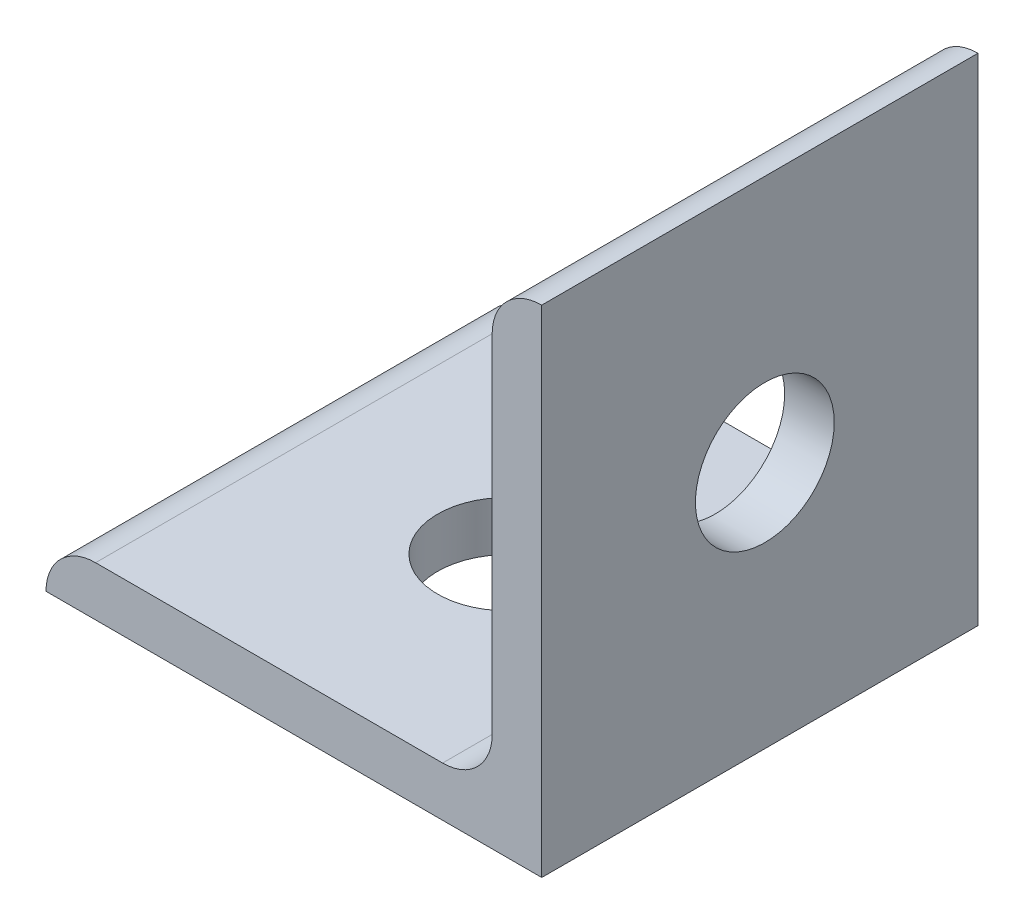
ISO-10303-21;
HEADER;
FILE_DESCRIPTION(('STEP AP214'),'2;1');
FILE_NAME('part.step','',(''),(''),'','','');
FILE_SCHEMA(('AUTOMOTIVE_DESIGN { 1 0 10303 214 1 1 1 1 }'));
ENDSEC;
DATA;
#1=APPLICATION_CONTEXT('core data for automotive mechanical design processes');
#2=APPLICATION_PROTOCOL_DEFINITION('international standard','automotive_design',2000,#1);
#3=PRODUCT_CONTEXT('',#1,'mechanical');
#4=PRODUCT('Part','Part','',(#3));
#5=PRODUCT_RELATED_PRODUCT_CATEGORY('part','',(#4));
#6=PRODUCT_DEFINITION_FORMATION('','',#4);
#7=PRODUCT_DEFINITION_CONTEXT('part definition',#1,'design');
#8=PRODUCT_DEFINITION('design','',#6,#7);
#9=PRODUCT_DEFINITION_SHAPE('','',#8);
#10=(LENGTH_UNIT() NAMED_UNIT(*) SI_UNIT(.MILLI.,.METRE.));
#11=(NAMED_UNIT(*) PLANE_ANGLE_UNIT() SI_UNIT($,.RADIAN.));
#12=(NAMED_UNIT(*) SI_UNIT($,.STERADIAN.) SOLID_ANGLE_UNIT());
#13=UNCERTAINTY_MEASURE_WITH_UNIT(LENGTH_MEASURE(1.E-05),#10,'distance_accuracy_value','');
#14=(GEOMETRIC_REPRESENTATION_CONTEXT(3) GLOBAL_UNCERTAINTY_ASSIGNED_CONTEXT((#13)) GLOBAL_UNIT_ASSIGNED_CONTEXT((#10,
#11,#12)) REPRESENTATION_CONTEXT('',''));
#15=CARTESIAN_POINT('',(0.,0.,0.));
#16=DIRECTION('',(0.,0.,1.));
#17=DIRECTION('',(1.,0.,0.));
#18=AXIS2_PLACEMENT_3D('',#15,#16,#17);
#19=CARTESIAN_POINT('',(13.97,-11.43,22.352));
#20=DIRECTION('',(-1.,0.,0.));
#21=DIRECTION('',(0.,0.,1.));
#22=AXIS2_PLACEMENT_3D('',#19,#20,#21);
#23=PLANE('',#22);
#24=CARTESIAN_POINT('',(13.97,-1.27,10.922));
#25=DIRECTION('',(1.,0.,0.));
#26=DIRECTION('',(0.,0.,-1.));
#27=AXIS2_PLACEMENT_3D('',#24,#25,#26);
#28=CIRCLE('',#27,3.556);
#29=CARTESIAN_POINT('',(13.97,-1.27,7.366));
#30=VERTEX_POINT('',#29);
#31=EDGE_CURVE('E171',#30,#30,#28,.T.);
#32=ORIENTED_EDGE('',*,*,#31,.F.);
#33=EDGE_LOOP('',(#32));
#34=FACE_BOUND('',#33,.T.);
#35=DIRECTION('',(0.,1.,0.));
#36=VECTOR('',#35,1.);
#37=CARTESIAN_POINT('',(13.97,-11.43,0.));
#38=LINE('',#37,#36);
#39=CARTESIAN_POINT('',(13.97,-13.97,0.));
#40=VERTEX_POINT('',#39);
#41=CARTESIAN_POINT('',(13.97,11.43,0.));
#42=VERTEX_POINT('',#41);
#43=EDGE_CURVE('E109',#40,#42,#38,.T.);
#44=ORIENTED_EDGE('',*,*,#43,.T.);
#45=DIRECTION('',(0.,0.,-1.));
#46=VECTOR('',#45,1.);
#47=CARTESIAN_POINT('',(13.97,11.43,22.352));
#48=LINE('',#47,#46);
#49=CARTESIAN_POINT('',(13.97,11.43,22.352));
#50=VERTEX_POINT('',#49);
#51=EDGE_CURVE('E107',#50,#42,#48,.T.);
#52=ORIENTED_EDGE('',*,*,#51,.F.);
#53=DIRECTION('',(0.,1.,0.));
#54=VECTOR('',#53,1.);
#55=CARTESIAN_POINT('',(13.97,-11.43,22.352));
#56=LINE('',#55,#54);
#57=CARTESIAN_POINT('',(13.97,-13.97,22.352));
#58=VERTEX_POINT('',#57);
#59=EDGE_CURVE('E91',#58,#50,#56,.T.);
#60=ORIENTED_EDGE('',*,*,#59,.F.);
#61=DIRECTION('',(0.,0.,-1.));
#62=VECTOR('',#61,1.);
#63=CARTESIAN_POINT('',(13.97,-13.97,22.352));
#64=LINE('',#63,#62);
#65=EDGE_CURVE('E156',#58,#40,#64,.T.);
#66=ORIENTED_EDGE('',*,*,#65,.T.);
#67=EDGE_LOOP('',(#44,#52,#60,#66));
#68=FACE_BOUND('',#67,.T.);
#69=ADVANCED_FACE('F34',(#34,#68),#23,.F.);
#70=CARTESIAN_POINT('',(11.43,-11.43,22.352));
#71=DIRECTION('',(-1.,0.,0.));
#72=DIRECTION('',(0.,0.,1.));
#73=AXIS2_PLACEMENT_3D('',#70,#71,#72);
#74=PLANE('',#73);
#75=CARTESIAN_POINT('',(11.43,-1.27,10.922));
#76=DIRECTION('',(1.,0.,0.));
#77=DIRECTION('',(0.,0.,-1.));
#78=AXIS2_PLACEMENT_3D('',#75,#76,#77);
#79=CIRCLE('',#78,3.556);
#80=CARTESIAN_POINT('',(11.43,-1.27,7.366));
#81=VERTEX_POINT('',#80);
#82=EDGE_CURVE('E169',#81,#81,#79,.T.);
#83=ORIENTED_EDGE('',*,*,#82,.T.);
#84=EDGE_LOOP('',(#83));
#85=FACE_BOUND('',#84,.T.);
#86=DIRECTION('',(0.,1.,0.));
#87=VECTOR('',#86,1.);
#88=CARTESIAN_POINT('',(11.43,-11.43,22.352));
#89=LINE('',#88,#87);
#90=CARTESIAN_POINT('',(11.43,-8.89,22.352));
#91=VERTEX_POINT('',#90);
#92=CARTESIAN_POINT('',(11.43,8.89,22.352));
#93=VERTEX_POINT('',#92);
#94=EDGE_CURVE('E102',#91,#93,#89,.T.);
#95=ORIENTED_EDGE('',*,*,#94,.T.);
#96=DIRECTION('',(0.,0.,-1.));
#97=VECTOR('',#96,1.);
#98=CARTESIAN_POINT('',(11.43,8.89,22.352));
#99=LINE('',#98,#97);
#100=CARTESIAN_POINT('',(11.43,8.89,0.));
#101=VERTEX_POINT('',#100);
#102=EDGE_CURVE('E117',#93,#101,#99,.T.);
#103=ORIENTED_EDGE('',*,*,#102,.T.);
#104=DIRECTION('',(0.,1.,0.));
#105=VECTOR('',#104,1.);
#106=CARTESIAN_POINT('',(11.43,-11.43,0.));
#107=LINE('',#106,#105);
#108=CARTESIAN_POINT('',(11.43,-8.89,0.));
#109=VERTEX_POINT('',#108);
#110=EDGE_CURVE('E132',#109,#101,#107,.T.);
#111=ORIENTED_EDGE('',*,*,#110,.F.);
#112=DIRECTION('',(0.,0.,-1.));
#113=VECTOR('',#112,1.);
#114=CARTESIAN_POINT('',(11.43,-8.89,22.352));
#115=LINE('',#114,#113);
#116=EDGE_CURVE('E111',#109,#91,#115,.F.);
#117=ORIENTED_EDGE('',*,*,#116,.T.);
#118=EDGE_LOOP('',(#95,#103,#111,#117));
#119=FACE_BOUND('',#118,.T.);
#120=ADVANCED_FACE('F138',(#85,#119),#74,.T.);
#121=CARTESIAN_POINT('',(-11.43,-11.43,22.352));
#122=DIRECTION('',(0.,1.,0.));
#123=DIRECTION('',(0.,0.,1.));
#124=AXIS2_PLACEMENT_3D('',#121,#122,#123);
#125=PLANE('',#124);
#126=CARTESIAN_POINT('',(1.27,-11.43,11.43));
#127=DIRECTION('',(0.,-1.,0.));
#128=DIRECTION('',(0.,0.,-1.));
#129=AXIS2_PLACEMENT_3D('',#126,#127,#128);
#130=CIRCLE('',#129,3.556);
#131=CARTESIAN_POINT('',(1.27,-11.43,7.874));
#132=VERTEX_POINT('',#131);
#133=EDGE_CURVE('E146',#132,#132,#130,.T.);
#134=ORIENTED_EDGE('',*,*,#133,.T.);
#135=EDGE_LOOP('',(#134));
#136=FACE_BOUND('',#135,.T.);
#137=DIRECTION('',(1.,0.,0.));
#138=VECTOR('',#137,1.);
#139=CARTESIAN_POINT('',(-11.43,-11.43,0.));
#140=LINE('',#139,#138);
#141=CARTESIAN_POINT('',(-8.89,-11.43,0.));
#142=VERTEX_POINT('',#141);
#143=CARTESIAN_POINT('',(8.89,-11.43,0.));
#144=VERTEX_POINT('',#143);
#145=EDGE_CURVE('E133',#142,#144,#140,.T.);
#146=ORIENTED_EDGE('',*,*,#145,.F.);
#147=DIRECTION('',(0.,0.,-1.));
#148=VECTOR('',#147,1.);
#149=CARTESIAN_POINT('',(-8.89,-11.43,22.352));
#150=LINE('',#149,#148);
#151=CARTESIAN_POINT('',(-8.89,-11.43,22.352));
#152=VERTEX_POINT('',#151);
#153=EDGE_CURVE('E54',#142,#152,#150,.F.);
#154=ORIENTED_EDGE('',*,*,#153,.T.);
#155=DIRECTION('',(1.,0.,0.));
#156=VECTOR('',#155,1.);
#157=CARTESIAN_POINT('',(-11.43,-11.43,22.352));
#158=LINE('',#157,#156);
#159=CARTESIAN_POINT('',(8.89,-11.43,22.352));
#160=VERTEX_POINT('',#159);
#161=EDGE_CURVE('E165',#152,#160,#158,.T.);
#162=ORIENTED_EDGE('',*,*,#161,.T.);
#163=DIRECTION('',(0.,0.,-1.));
#164=VECTOR('',#163,1.);
#165=CARTESIAN_POINT('',(8.89,-11.43,0.));
#166=LINE('',#165,#164);
#167=EDGE_CURVE('E118',#160,#144,#166,.T.);
#168=ORIENTED_EDGE('',*,*,#167,.T.);
#169=EDGE_LOOP('',(#146,#154,#162,#168));
#170=FACE_BOUND('',#169,.T.);
#171=ADVANCED_FACE('F164',(#136,#170),#125,.T.);
#172=CARTESIAN_POINT('',(-11.43,-13.97,22.352));
#173=DIRECTION('',(0.,1.,0.));
#174=DIRECTION('',(0.,0.,1.));
#175=AXIS2_PLACEMENT_3D('',#172,#173,#174);
#176=PLANE('',#175);
#177=CARTESIAN_POINT('',(1.27,-13.97,11.43));
#178=DIRECTION('',(0.,-1.,0.));
#179=DIRECTION('',(0.,0.,-1.));
#180=AXIS2_PLACEMENT_3D('',#177,#178,#179);
#181=CIRCLE('',#180,3.556);
#182=CARTESIAN_POINT('',(1.27,-13.97,7.874));
#183=VERTEX_POINT('',#182);
#184=EDGE_CURVE('E149',#183,#183,#181,.T.);
#185=ORIENTED_EDGE('',*,*,#184,.F.);
#186=EDGE_LOOP('',(#185));
#187=FACE_BOUND('',#186,.T.);
#188=DIRECTION('',(1.,0.,0.));
#189=VECTOR('',#188,1.);
#190=CARTESIAN_POINT('',(-11.43,-13.97,0.));
#191=LINE('',#190,#189);
#192=CARTESIAN_POINT('',(-11.43,-13.97,0.));
#193=VERTEX_POINT('',#192);
#194=EDGE_CURVE('E103',#193,#40,#191,.T.);
#195=ORIENTED_EDGE('',*,*,#194,.T.);
#196=ORIENTED_EDGE('',*,*,#65,.F.);
#197=DIRECTION('',(1.,0.,0.));
#198=VECTOR('',#197,1.);
#199=CARTESIAN_POINT('',(-11.43,-13.97,22.352));
#200=LINE('',#199,#198);
#201=CARTESIAN_POINT('',(-11.43,-13.97,22.352));
#202=VERTEX_POINT('',#201);
#203=EDGE_CURVE('E98',#202,#58,#200,.T.);
#204=ORIENTED_EDGE('',*,*,#203,.F.);
#205=DIRECTION('',(0.,0.,-1.));
#206=VECTOR('',#205,1.);
#207=CARTESIAN_POINT('',(-11.43,-13.97,22.352));
#208=LINE('',#207,#206);
#209=EDGE_CURVE('E112',#202,#193,#208,.T.);
#210=ORIENTED_EDGE('',*,*,#209,.T.);
#211=EDGE_LOOP('',(#195,#196,#204,#210));
#212=FACE_BOUND('',#211,.T.);
#213=ADVANCED_FACE('F160',(#187,#212),#176,.F.);
#214=CARTESIAN_POINT('',(0.,0.,22.352));
#215=DIRECTION('',(0.,0.,-1.));
#216=DIRECTION('',(-1.,0.,0.));
#217=AXIS2_PLACEMENT_3D('',#214,#215,#216);
#218=PLANE('',#217);
#219=ORIENTED_EDGE('',*,*,#59,.T.);
#220=CARTESIAN_POINT('',(13.97,8.89,22.352));
#221=DIRECTION('',(0.,0.,-1.));
#222=DIRECTION('',(-1.,0.,0.));
#223=AXIS2_PLACEMENT_3D('',#220,#221,#222);
#224=CIRCLE('',#223,2.54);
#225=EDGE_CURVE('E95',#50,#93,#224,.F.);
#226=ORIENTED_EDGE('',*,*,#225,.T.);
#227=ORIENTED_EDGE('',*,*,#94,.F.);
#228=CARTESIAN_POINT('',(8.89,-8.89,22.352));
#229=DIRECTION('',(0.,0.,-1.));
#230=DIRECTION('',(-1.,0.,0.));
#231=AXIS2_PLACEMENT_3D('',#228,#229,#230);
#232=CIRCLE('',#231,2.54);
#233=EDGE_CURVE('E11',#91,#160,#232,.T.);
#234=ORIENTED_EDGE('',*,*,#233,.T.);
#235=ORIENTED_EDGE('',*,*,#161,.F.);
#236=CARTESIAN_POINT('',(-8.89,-13.97,22.352));
#237=DIRECTION('',(0.,0.,-1.));
#238=DIRECTION('',(-1.,0.,0.));
#239=AXIS2_PLACEMENT_3D('',#236,#237,#238);
#240=CIRCLE('',#239,2.54);
#241=EDGE_CURVE('E119',#152,#202,#240,.F.);
#242=ORIENTED_EDGE('',*,*,#241,.T.);
#243=ORIENTED_EDGE('',*,*,#203,.T.);
#244=EDGE_LOOP('',(#219,#226,#227,#234,#235,#242,#243));
#245=FACE_BOUND('',#244,.T.);
#246=ADVANCED_FACE('F93',(#245),#218,.F.);
#247=CARTESIAN_POINT('',(0.,0.,0.));
#248=DIRECTION('',(0.,0.,-1.));
#249=DIRECTION('',(-1.,0.,0.));
#250=AXIS2_PLACEMENT_3D('',#247,#248,#249);
#251=PLANE('',#250);
#252=ORIENTED_EDGE('',*,*,#110,.T.);
#253=CARTESIAN_POINT('',(13.97,8.89,0.));
#254=DIRECTION('',(0.,0.,-1.));
#255=DIRECTION('',(-1.,0.,0.));
#256=AXIS2_PLACEMENT_3D('',#253,#254,#255);
#257=CIRCLE('',#256,2.54);
#258=EDGE_CURVE('E123',#101,#42,#257,.T.);
#259=ORIENTED_EDGE('',*,*,#258,.T.);
#260=ORIENTED_EDGE('',*,*,#43,.F.);
#261=ORIENTED_EDGE('',*,*,#194,.F.);
#262=CARTESIAN_POINT('',(-8.89,-13.97,0.));
#263=DIRECTION('',(0.,0.,-1.));
#264=DIRECTION('',(-1.,0.,0.));
#265=AXIS2_PLACEMENT_3D('',#262,#263,#264);
#266=CIRCLE('',#265,2.54);
#267=EDGE_CURVE('E141',#193,#142,#266,.T.);
#268=ORIENTED_EDGE('',*,*,#267,.T.);
#269=ORIENTED_EDGE('',*,*,#145,.T.);
#270=CARTESIAN_POINT('',(8.89,-8.89,0.));
#271=DIRECTION('',(0.,0.,-1.));
#272=DIRECTION('',(-1.,0.,0.));
#273=AXIS2_PLACEMENT_3D('',#270,#271,#272);
#274=CIRCLE('',#273,2.54);
#275=EDGE_CURVE('E42',#144,#109,#274,.F.);
#276=ORIENTED_EDGE('',*,*,#275,.T.);
#277=EDGE_LOOP('',(#252,#259,#260,#261,#268,#269,#276));
#278=FACE_BOUND('',#277,.T.);
#279=ADVANCED_FACE('F131',(#278),#251,.T.);
#280=CARTESIAN_POINT('',(13.97,8.89,22.352));
#281=DIRECTION('',(0.,0.,-1.));
#282=DIRECTION('',(-1.,0.,0.));
#283=AXIS2_PLACEMENT_3D('',#280,#281,#282);
#284=CYLINDRICAL_SURFACE('',#283,2.54);
#285=ORIENTED_EDGE('',*,*,#225,.F.);
#286=ORIENTED_EDGE('',*,*,#51,.T.);
#287=ORIENTED_EDGE('',*,*,#258,.F.);
#288=ORIENTED_EDGE('',*,*,#102,.F.);
#289=EDGE_LOOP('',(#285,#286,#287,#288));
#290=FACE_BOUND('',#289,.T.);
#291=ADVANCED_FACE('F115',(#290),#284,.T.);
#292=CARTESIAN_POINT('',(-8.89,-13.97,22.352));
#293=DIRECTION('',(0.,0.,-1.));
#294=DIRECTION('',(-1.,0.,0.));
#295=AXIS2_PLACEMENT_3D('',#292,#293,#294);
#296=CYLINDRICAL_SURFACE('',#295,2.54);
#297=ORIENTED_EDGE('',*,*,#241,.F.);
#298=ORIENTED_EDGE('',*,*,#153,.F.);
#299=ORIENTED_EDGE('',*,*,#267,.F.);
#300=ORIENTED_EDGE('',*,*,#209,.F.);
#301=EDGE_LOOP('',(#297,#298,#299,#300));
#302=FACE_BOUND('',#301,.T.);
#303=ADVANCED_FACE('F163',(#302),#296,.T.);
#304=CARTESIAN_POINT('',(8.89,-8.89,22.352));
#305=DIRECTION('',(0.,0.,1.));
#306=DIRECTION('',(1.,0.,0.));
#307=AXIS2_PLACEMENT_3D('',#304,#305,#306);
#308=CYLINDRICAL_SURFACE('',#307,2.54);
#309=ORIENTED_EDGE('',*,*,#233,.F.);
#310=ORIENTED_EDGE('',*,*,#116,.F.);
#311=ORIENTED_EDGE('',*,*,#275,.F.);
#312=ORIENTED_EDGE('',*,*,#167,.F.);
#313=EDGE_LOOP('',(#309,#310,#311,#312));
#314=FACE_BOUND('',#313,.T.);
#315=ADVANCED_FACE('F36',(#314),#308,.F.);
#316=CARTESIAN_POINT('',(1.27,-11.43,11.43));
#317=DIRECTION('',(0.,-1.,0.));
#318=DIRECTION('',(0.,0.,-1.));
#319=AXIS2_PLACEMENT_3D('',#316,#317,#318);
#320=CYLINDRICAL_SURFACE('',#319,3.556);
#321=ORIENTED_EDGE('',*,*,#133,.F.);
#322=EDGE_LOOP('',(#321));
#323=FACE_BOUND('',#322,.T.);
#324=ORIENTED_EDGE('',*,*,#184,.T.);
#325=EDGE_LOOP('',(#324));
#326=FACE_BOUND('',#325,.T.);
#327=ADVANCED_FACE('F181',(#323,#326),#320,.F.);
#328=CARTESIAN_POINT('',(11.43,-1.27,10.922));
#329=DIRECTION('',(1.,0.,0.));
#330=DIRECTION('',(0.,0.,-1.));
#331=AXIS2_PLACEMENT_3D('',#328,#329,#330);
#332=CYLINDRICAL_SURFACE('',#331,3.556);
#333=ORIENTED_EDGE('',*,*,#82,.F.);
#334=EDGE_LOOP('',(#333));
#335=FACE_BOUND('',#334,.T.);
#336=ORIENTED_EDGE('',*,*,#31,.T.);
#337=EDGE_LOOP('',(#336));
#338=FACE_BOUND('',#337,.T.);
#339=ADVANCED_FACE('F178',(#335,#338),#332,.F.);
#340=CLOSED_SHELL('',(#69,#120,#171,#213,#246,#279,#291,#303,#315,#327,#339));
#341=MANIFOLD_SOLID_BREP('B2',#340);
#342=ADVANCED_BREP_SHAPE_REPRESENTATION('',(#18,#341),#14);
#343=SHAPE_DEFINITION_REPRESENTATION(#9,#342);
ENDSEC;
END-ISO-10303-21;
